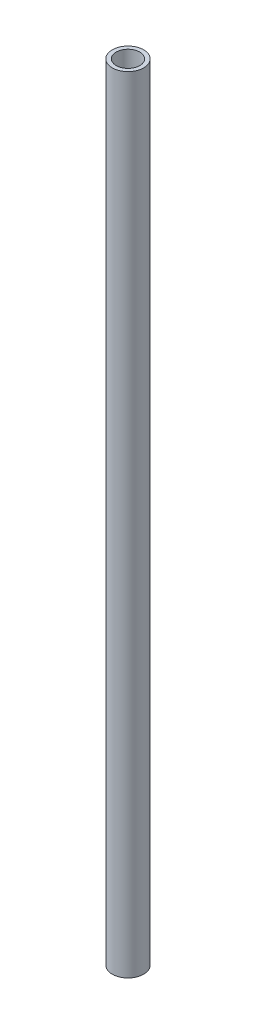
ISO-10303-21;
HEADER;
FILE_DESCRIPTION(('STEP AP214'),'2;1');
FILE_NAME('part.step','',(''),(''),'','','');
FILE_SCHEMA(('AUTOMOTIVE_DESIGN { 1 0 10303 214 1 1 1 1 }'));
ENDSEC;
DATA;
#1=APPLICATION_CONTEXT('core data for automotive mechanical design processes');
#2=APPLICATION_PROTOCOL_DEFINITION('international standard','automotive_design',2000,#1);
#3=PRODUCT_CONTEXT('',#1,'mechanical');
#4=PRODUCT('Part','Part','',(#3));
#5=PRODUCT_RELATED_PRODUCT_CATEGORY('part','',(#4));
#6=PRODUCT_DEFINITION_FORMATION('','',#4);
#7=PRODUCT_DEFINITION_CONTEXT('part definition',#1,'design');
#8=PRODUCT_DEFINITION('design','',#6,#7);
#9=PRODUCT_DEFINITION_SHAPE('','',#8);
#10=(LENGTH_UNIT() NAMED_UNIT(*) SI_UNIT(.MILLI.,.METRE.));
#11=(NAMED_UNIT(*) PLANE_ANGLE_UNIT() SI_UNIT($,.RADIAN.));
#12=(NAMED_UNIT(*) SI_UNIT($,.STERADIAN.) SOLID_ANGLE_UNIT());
#13=UNCERTAINTY_MEASURE_WITH_UNIT(LENGTH_MEASURE(1.E-05),#10,'distance_accuracy_value','');
#14=(GEOMETRIC_REPRESENTATION_CONTEXT(3) GLOBAL_UNCERTAINTY_ASSIGNED_CONTEXT((#13)) GLOBAL_UNIT_ASSIGNED_CONTEXT((#10,
#11,#12)) REPRESENTATION_CONTEXT('',''));
#15=CARTESIAN_POINT('',(0.,0.,0.));
#16=DIRECTION('',(0.,0.,1.));
#17=DIRECTION('',(1.,0.,0.));
#18=AXIS2_PLACEMENT_3D('',#15,#16,#17);
#19=CARTESIAN_POINT('',(0.,100.,0.));
#20=DIRECTION('',(0.,1.,0.));
#21=DIRECTION('',(0.,0.,1.));
#22=AXIS2_PLACEMENT_3D('',#19,#20,#21);
#23=PLANE('',#22);
#24=CARTESIAN_POINT('',(0.,100.,0.));
#25=DIRECTION('',(0.,1.,0.));
#26=DIRECTION('',(0.,0.,1.));
#27=AXIS2_PLACEMENT_3D('',#24,#25,#26);
#28=CIRCLE('',#27,4.);
#29=CARTESIAN_POINT('',(0.,100.,4.));
#30=VERTEX_POINT('',#29);
#31=EDGE_CURVE('E10',#30,#30,#28,.T.);
#32=ORIENTED_EDGE('',*,*,#31,.T.);
#33=EDGE_LOOP('',(#32));
#34=FACE_BOUND('',#33,.T.);
#35=CARTESIAN_POINT('',(0.,100.,0.));
#36=DIRECTION('',(0.,1.,0.));
#37=DIRECTION('',(0.,0.,1.));
#38=AXIS2_PLACEMENT_3D('',#35,#36,#37);
#39=CIRCLE('',#38,3.);
#40=CARTESIAN_POINT('',(0.,100.,3.));
#41=VERTEX_POINT('',#40);
#42=EDGE_CURVE('E47',#41,#41,#39,.T.);
#43=ORIENTED_EDGE('',*,*,#42,.F.);
#44=EDGE_LOOP('',(#43));
#45=FACE_BOUND('',#44,.T.);
#46=ADVANCED_FACE('F36',(#34,#45),#23,.T.);
#47=CARTESIAN_POINT('',(0.,-100.,0.));
#48=DIRECTION('',(0.,1.,0.));
#49=DIRECTION('',(0.,0.,1.));
#50=AXIS2_PLACEMENT_3D('',#47,#48,#49);
#51=PLANE('',#50);
#52=CARTESIAN_POINT('',(0.,-100.,0.));
#53=DIRECTION('',(0.,1.,0.));
#54=DIRECTION('',(0.,0.,1.));
#55=AXIS2_PLACEMENT_3D('',#52,#53,#54);
#56=CIRCLE('',#55,4.);
#57=CARTESIAN_POINT('',(0.,-100.,4.));
#58=VERTEX_POINT('',#57);
#59=EDGE_CURVE('E40',#58,#58,#56,.T.);
#60=ORIENTED_EDGE('',*,*,#59,.F.);
#61=EDGE_LOOP('',(#60));
#62=FACE_BOUND('',#61,.T.);
#63=CARTESIAN_POINT('',(0.,-100.,0.));
#64=DIRECTION('',(0.,1.,0.));
#65=DIRECTION('',(0.,0.,1.));
#66=AXIS2_PLACEMENT_3D('',#63,#64,#65);
#67=CIRCLE('',#66,3.);
#68=CARTESIAN_POINT('',(0.,-100.,3.));
#69=VERTEX_POINT('',#68);
#70=EDGE_CURVE('E49',#69,#69,#67,.T.);
#71=ORIENTED_EDGE('',*,*,#70,.T.);
#72=EDGE_LOOP('',(#71));
#73=FACE_BOUND('',#72,.T.);
#74=ADVANCED_FACE('F59',(#62,#73),#51,.F.);
#75=CARTESIAN_POINT('',(0.,100.,0.));
#76=DIRECTION('',(0.,-1.,0.));
#77=DIRECTION('',(0.,0.,-1.));
#78=AXIS2_PLACEMENT_3D('',#75,#76,#77);
#79=CYLINDRICAL_SURFACE('',#78,4.);
#80=ORIENTED_EDGE('',*,*,#31,.F.);
#81=EDGE_LOOP('',(#80));
#82=FACE_BOUND('',#81,.T.);
#83=ORIENTED_EDGE('',*,*,#59,.T.);
#84=EDGE_LOOP('',(#83));
#85=FACE_BOUND('',#84,.T.);
#86=ADVANCED_FACE('F38',(#82,#85),#79,.T.);
#87=CARTESIAN_POINT('',(0.,100.,0.));
#88=DIRECTION('',(0.,-1.,0.));
#89=DIRECTION('',(0.,0.,-1.));
#90=AXIS2_PLACEMENT_3D('',#87,#88,#89);
#91=CYLINDRICAL_SURFACE('',#90,3.);
#92=ORIENTED_EDGE('',*,*,#42,.T.);
#93=EDGE_LOOP('',(#92));
#94=FACE_BOUND('',#93,.T.);
#95=ORIENTED_EDGE('',*,*,#70,.F.);
#96=EDGE_LOOP('',(#95));
#97=FACE_BOUND('',#96,.T.);
#98=ADVANCED_FACE('F55',(#94,#97),#91,.F.);
#99=CLOSED_SHELL('',(#46,#74,#86,#98));
#100=MANIFOLD_SOLID_BREP('B2',#99);
#101=ADVANCED_BREP_SHAPE_REPRESENTATION('',(#18,#100),#14);
#102=SHAPE_DEFINITION_REPRESENTATION(#9,#101);
ENDSEC;
END-ISO-10303-21;
